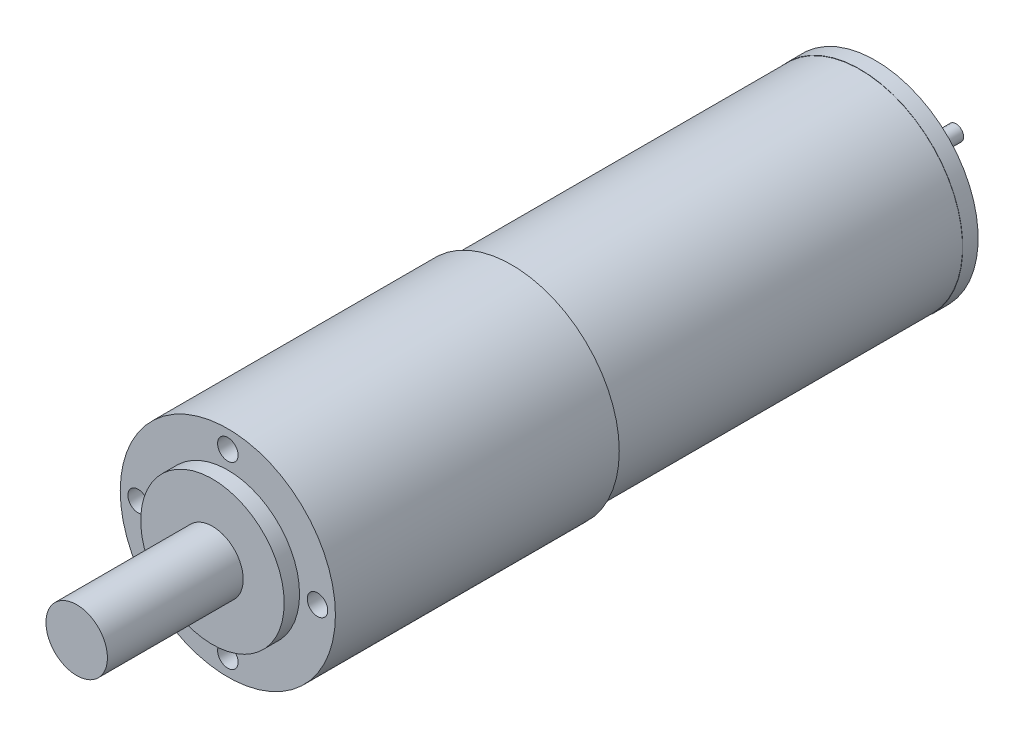
ISO-10303-21;
HEADER;
FILE_DESCRIPTION(('STEP AP214'),'2;1');
FILE_NAME('part.step','',(''),(''),'','','');
FILE_SCHEMA(('AUTOMOTIVE_DESIGN { 1 0 10303 214 1 1 1 1 }'));
ENDSEC;
DATA;
#1=APPLICATION_CONTEXT('core data for automotive mechanical design processes');
#2=APPLICATION_PROTOCOL_DEFINITION('international standard','automotive_design',2000,#1);
#3=PRODUCT_CONTEXT('',#1,'mechanical');
#4=PRODUCT('Part','Part','',(#3));
#5=PRODUCT_RELATED_PRODUCT_CATEGORY('part','',(#4));
#6=PRODUCT_DEFINITION_FORMATION('','',#4);
#7=PRODUCT_DEFINITION_CONTEXT('part definition',#1,'design');
#8=PRODUCT_DEFINITION('design','',#6,#7);
#9=PRODUCT_DEFINITION_SHAPE('','',#8);
#10=(LENGTH_UNIT() NAMED_UNIT(*) SI_UNIT(.MILLI.,.METRE.));
#11=(NAMED_UNIT(*) PLANE_ANGLE_UNIT() SI_UNIT($,.RADIAN.));
#12=(NAMED_UNIT(*) SI_UNIT($,.STERADIAN.) SOLID_ANGLE_UNIT());
#13=UNCERTAINTY_MEASURE_WITH_UNIT(LENGTH_MEASURE(1.E-05),#10,'distance_accuracy_value','');
#14=(GEOMETRIC_REPRESENTATION_CONTEXT(3) GLOBAL_UNCERTAINTY_ASSIGNED_CONTEXT((#13)) GLOBAL_UNIT_ASSIGNED_CONTEXT((#10,
#11,#12)) REPRESENTATION_CONTEXT('',''));
#15=CARTESIAN_POINT('',(0.,0.,0.));
#16=DIRECTION('',(0.,0.,1.));
#17=DIRECTION('',(1.,0.,0.));
#18=AXIS2_PLACEMENT_3D('',#15,#16,#17);
#19=CARTESIAN_POINT('',(0.,0.,-1.35));
#20=DIRECTION('',(0.,0.,-1.));
#21=DIRECTION('',(-1.,0.,0.));
#22=AXIS2_PLACEMENT_3D('',#19,#20,#21);
#23=PLANE('',#22);
#24=CARTESIAN_POINT('',(0.,0.,-1.35));
#25=DIRECTION('',(0.,0.,-1.));
#26=DIRECTION('',(-1.,0.,0.));
#27=AXIS2_PLACEMENT_3D('',#24,#25,#26);
#28=CIRCLE('',#27,4.);
#29=CARTESIAN_POINT('',(4.,0.,-1.35));
#30=VERTEX_POINT('',#29);
#31=EDGE_CURVE('E181',#30,#30,#28,.T.);
#32=ORIENTED_EDGE('',*,*,#31,.T.);
#33=EDGE_LOOP('',(#32));
#34=FACE_BOUND('',#33,.T.);
#35=CARTESIAN_POINT('',(0.,0.,-1.35));
#36=DIRECTION('',(0.,0.,-1.));
#37=DIRECTION('',(-1.,0.,0.));
#38=AXIS2_PLACEMENT_3D('',#35,#36,#37);
#39=CIRCLE('',#38,1.5);
#40=CARTESIAN_POINT('',(-1.5,0.,-1.35));
#41=VERTEX_POINT('',#40);
#42=EDGE_CURVE('E180',#41,#41,#39,.F.);
#43=ORIENTED_EDGE('',*,*,#42,.T.);
#44=EDGE_LOOP('',(#43));
#45=FACE_BOUND('',#44,.T.);
#46=ADVANCED_FACE('F34',(#34,#45),#23,.T.);
#47=CARTESIAN_POINT('',(0.,0.,0.));
#48=DIRECTION('',(0.,0.,1.));
#49=DIRECTION('',(1.,0.,0.));
#50=AXIS2_PLACEMENT_3D('',#47,#48,#49);
#51=PLANE('',#50);
#52=CARTESIAN_POINT('',(-9.04130635862028,-12.2186242813818,0.));
#53=DIRECTION('',(0.,0.,-1.));
#54=DIRECTION('',(-1.,0.,0.));
#55=AXIS2_PLACEMENT_3D('',#52,#53,#54);
#56=CIRCLE('',#55,1.);
#57=CARTESIAN_POINT('',(-10.0413063586203,-12.2186242813818,0.));
#58=VERTEX_POINT('',#57);
#59=EDGE_CURVE('E437',#58,#58,#56,.T.);
#60=ORIENTED_EDGE('',*,*,#59,.F.);
#61=EDGE_LOOP('',(#60));
#62=FACE_BOUND('',#61,.T.);
#63=CARTESIAN_POINT('',(-12.2186242813817,9.04130635862033,0.));
#64=DIRECTION('',(0.,0.,-1.));
#65=DIRECTION('',(-1.,0.,0.));
#66=AXIS2_PLACEMENT_3D('',#63,#64,#65);
#67=CIRCLE('',#66,1.);
#68=CARTESIAN_POINT('',(-13.2186242813817,9.04130635862033,0.));
#69=VERTEX_POINT('',#68);
#70=EDGE_CURVE('E443',#69,#69,#67,.T.);
#71=ORIENTED_EDGE('',*,*,#70,.F.);
#72=EDGE_LOOP('',(#71));
#73=FACE_BOUND('',#72,.T.);
#74=CARTESIAN_POINT('',(9.04130635862037,12.2186242813817,0.));
#75=DIRECTION('',(0.,0.,-1.));
#76=DIRECTION('',(-1.,0.,0.));
#77=AXIS2_PLACEMENT_3D('',#74,#75,#76);
#78=CIRCLE('',#77,1.);
#79=CARTESIAN_POINT('',(8.04130635862037,12.2186242813817,0.));
#80=VERTEX_POINT('',#79);
#81=EDGE_CURVE('E449',#80,#80,#78,.T.);
#82=ORIENTED_EDGE('',*,*,#81,.F.);
#83=EDGE_LOOP('',(#82));
#84=FACE_BOUND('',#83,.T.);
#85=CARTESIAN_POINT('',(10.2089821298386,-7.55424939174206,0.));
#86=DIRECTION('',(0.,0.,-1.));
#87=DIRECTION('',(-1.,0.,0.));
#88=AXIS2_PLACEMENT_3D('',#85,#86,#87);
#89=CIRCLE('',#88,0.800000000000001);
#90=CARTESIAN_POINT('',(9.40898212983864,-7.55424939174206,0.));
#91=VERTEX_POINT('',#90);
#92=EDGE_CURVE('E455',#91,#91,#89,.T.);
#93=ORIENTED_EDGE('',*,*,#92,.F.);
#94=EDGE_LOOP('',(#93));
#95=FACE_BOUND('',#94,.T.);
#96=CARTESIAN_POINT('',(-10.2089821298386,7.55424939174205,0.));
#97=DIRECTION('',(0.,0.,-1.));
#98=DIRECTION('',(-1.,0.,0.));
#99=AXIS2_PLACEMENT_3D('',#96,#97,#98);
#100=CIRCLE('',#99,0.800000000000001);
#101=CARTESIAN_POINT('',(-11.0089821298386,7.55424939174205,0.));
#102=VERTEX_POINT('',#101);
#103=EDGE_CURVE('E461',#102,#102,#100,.T.);
#104=ORIENTED_EDGE('',*,*,#103,.F.);
#105=EDGE_LOOP('',(#104));
#106=FACE_BOUND('',#105,.T.);
#107=CARTESIAN_POINT('',(12.2186242813817,-9.04130635862041,0.));
#108=DIRECTION('',(0.,0.,-1.));
#109=DIRECTION('',(-1.,0.,0.));
#110=AXIS2_PLACEMENT_3D('',#107,#108,#109);
#111=CIRCLE('',#110,1.);
#112=CARTESIAN_POINT('',(11.2186242813817,-9.04130635862041,0.));
#113=VERTEX_POINT('',#112);
#114=EDGE_CURVE('E467',#113,#113,#111,.T.);
#115=ORIENTED_EDGE('',*,*,#114,.F.);
#116=EDGE_LOOP('',(#115));
#117=FACE_BOUND('',#116,.T.);
#118=CARTESIAN_POINT('',(1.72068884927214,15.1022922062841,0.));
#119=DIRECTION('',(0.,0.,-1.));
#120=DIRECTION('',(-1.,0.,0.));
#121=AXIS2_PLACEMENT_3D('',#118,#119,#120);
#122=CIRCLE('',#121,1.);
#123=CARTESIAN_POINT('',(0.720688849272138,15.1022922062841,0.));
#124=VERTEX_POINT('',#123);
#125=EDGE_CURVE('E473',#124,#124,#122,.T.);
#126=ORIENTED_EDGE('',*,*,#125,.F.);
#127=EDGE_LOOP('',(#126));
#128=FACE_BOUND('',#127,.T.);
#129=CARTESIAN_POINT('',(-1.72068884927214,-15.1022922062841,0.));
#130=DIRECTION('',(0.,0.,-1.));
#131=DIRECTION('',(-1.,0.,0.));
#132=AXIS2_PLACEMENT_3D('',#129,#130,#131);
#133=CIRCLE('',#132,1.);
#134=CARTESIAN_POINT('',(-2.72068884927214,-15.1022922062841,0.));
#135=VERTEX_POINT('',#134);
#136=EDGE_CURVE('E125',#135,#135,#133,.T.);
#137=ORIENTED_EDGE('',*,*,#136,.F.);
#138=EDGE_LOOP('',(#137));
#139=FACE_BOUND('',#138,.T.);
#140=DIRECTION('',(-0.965925826289066,-0.258819045102528,0.));
#141=VECTOR('',#140,1.);
#142=CARTESIAN_POINT('',(-12.2595640172225,-5.87313072899772,0.));
#143=LINE('',#142,#141);
#144=CARTESIAN_POINT('',(-12.2595640172225,-5.87313072899772,0.));
#145=VERTEX_POINT('',#144);
#146=CARTESIAN_POINT('',(-18.0551189749569,-7.42604499961289,0.));
#147=VERTEX_POINT('',#146);
#148=EDGE_CURVE('E131',#145,#147,#143,.T.);
#149=ORIENTED_EDGE('',*,*,#148,.F.);
#150=DIRECTION('',(0.258819045102528,-0.965925826289066,0.));
#151=VECTOR('',#150,1.);
#152=CARTESIAN_POINT('',(-13.5536592427351,-1.04350159755239,0.));
#153=LINE('',#152,#151);
#154=CARTESIAN_POINT('',(-13.5536592427351,-1.04350159755239,0.));
#155=VERTEX_POINT('',#154);
#156=EDGE_CURVE('E49',#155,#145,#153,.T.);
#157=ORIENTED_EDGE('',*,*,#156,.F.);
#158=DIRECTION('',(0.965925826289066,0.258819045102528,0.));
#159=VECTOR('',#158,1.);
#160=CARTESIAN_POINT('',(-13.5536592427351,-1.04350159755239,0.));
#161=LINE('',#160,#159);
#162=CARTESIAN_POINT('',(-19.3492142004695,-2.59641586816756,0.));
#163=VERTEX_POINT('',#162);
#164=EDGE_CURVE('E119',#163,#155,#161,.T.);
#165=ORIENTED_EDGE('',*,*,#164,.F.);
#166=DIRECTION('',(-0.258819045102528,0.965925826289066,0.));
#167=VECTOR('',#166,1.);
#168=CARTESIAN_POINT('',(-19.3492142004695,-2.59641586816756,0.));
#169=LINE('',#168,#167);
#170=EDGE_CURVE('E122',#147,#163,#169,.T.);
#171=ORIENTED_EDGE('',*,*,#170,.F.);
#172=EDGE_LOOP('',(#149,#157,#165,#171));
#173=FACE_BOUND('',#172,.T.);
#174=DIRECTION('',(0.989015863361917,0.147809411129611,0.));
#175=VECTOR('',#174,1.);
#176=CARTESIAN_POINT('',(12.8456150437793,4.44755535089839,0.));
#177=LINE('',#176,#175);
#178=CARTESIAN_POINT('',(12.8456150437793,4.44755535089839,0.));
#179=VERTEX_POINT('',#178);
#180=CARTESIAN_POINT('',(18.7797102239508,5.33441181767605,0.));
#181=VERTEX_POINT('',#180);
#182=EDGE_CURVE('E156',#179,#181,#177,.T.);
#183=ORIENTED_EDGE('',*,*,#182,.F.);
#184=DIRECTION('',(-0.147809411129612,0.989015863361917,0.));
#185=VECTOR('',#184,1.);
#186=CARTESIAN_POINT('',(13.5846620994273,-0.497523965911195,0.));
#187=LINE('',#186,#185);
#188=CARTESIAN_POINT('',(13.5846620994273,-0.497523965911195,0.));
#189=VERTEX_POINT('',#188);
#190=EDGE_CURVE('E57',#189,#179,#187,.T.);
#191=ORIENTED_EDGE('',*,*,#190,.F.);
#192=DIRECTION('',(-0.989015863361917,-0.147809411129611,0.));
#193=VECTOR('',#192,1.);
#194=CARTESIAN_POINT('',(13.5846620994273,-0.497523965911195,0.));
#195=LINE('',#194,#193);
#196=CARTESIAN_POINT('',(19.5187572795988,0.389332500866468,0.));
#197=VERTEX_POINT('',#196);
#198=EDGE_CURVE('E145',#197,#189,#195,.T.);
#199=ORIENTED_EDGE('',*,*,#198,.F.);
#200=DIRECTION('',(0.14780941112961,-0.989015863361917,0.));
#201=VECTOR('',#200,1.);
#202=CARTESIAN_POINT('',(19.5187572795988,0.389332500866468,0.));
#203=LINE('',#202,#201);
#204=EDGE_CURVE('E159',#181,#197,#203,.T.);
#205=ORIENTED_EDGE('',*,*,#204,.F.);
#206=EDGE_LOOP('',(#183,#191,#199,#205));
#207=FACE_BOUND('',#206,.T.);
#208=CARTESIAN_POINT('',(0.,0.,0.));
#209=DIRECTION('',(0.,0.,1.));
#210=DIRECTION('',(1.,0.,0.));
#211=AXIS2_PLACEMENT_3D('',#208,#209,#210);
#212=CIRCLE('',#211,4.);
#213=CARTESIAN_POINT('',(4.,0.,0.));
#214=VERTEX_POINT('',#213);
#215=EDGE_CURVE('E42',#214,#214,#212,.F.);
#216=ORIENTED_EDGE('',*,*,#215,.F.);
#217=EDGE_LOOP('',(#216));
#218=FACE_BOUND('',#217,.T.);
#219=CARTESIAN_POINT('',(0.,0.,0.));
#220=DIRECTION('',(0.,0.,-1.));
#221=DIRECTION('',(-1.,0.,0.));
#222=AXIS2_PLACEMENT_3D('',#219,#220,#221);
#223=CIRCLE('',#222,20.05);
#224=CARTESIAN_POINT('',(-20.05,0.,0.));
#225=VERTEX_POINT('',#224);
#226=EDGE_CURVE('E166',#225,#225,#223,.T.);
#227=ORIENTED_EDGE('',*,*,#226,.T.);
#228=EDGE_LOOP('',(#227));
#229=FACE_BOUND('',#228,.T.);
#230=ADVANCED_FACE('F211',(#62,#73,#84,#95,#106,#117,#128,#139,#173,#207,#218,#229),#51,.F.);
#231=CARTESIAN_POINT('',(0.,0.,-1.35));
#232=DIRECTION('',(0.,0.,1.));
#233=DIRECTION('',(1.,0.,0.));
#234=AXIS2_PLACEMENT_3D('',#231,#232,#233);
#235=CYLINDRICAL_SURFACE('',#234,4.);
#236=CARTESIAN_POINT('',(4.,0.,-1.35));
#237=CARTESIAN_POINT('',(4.,0.,-1.3359375));
#238=CARTESIAN_POINT('',(4.,0.,-1.321875));
#239=CARTESIAN_POINT('',(4.,0.,-1.29375));
#240=CARTESIAN_POINT('',(4.,0.,-1.2796875));
#241=CARTESIAN_POINT('',(4.,0.,-1.2515625));
#242=CARTESIAN_POINT('',(4.,0.,-1.2375));
#243=CARTESIAN_POINT('',(4.,0.,-1.209375));
#244=CARTESIAN_POINT('',(4.,0.,-1.1953125));
#245=CARTESIAN_POINT('',(4.,0.,-1.1671875));
#246=CARTESIAN_POINT('',(4.,0.,-1.153125));
#247=CARTESIAN_POINT('',(4.,0.,-1.125));
#248=CARTESIAN_POINT('',(4.,0.,-1.1109375));
#249=CARTESIAN_POINT('',(4.,0.,-1.0828125));
#250=CARTESIAN_POINT('',(4.,0.,-1.06875));
#251=CARTESIAN_POINT('',(4.,0.,-1.040625));
#252=CARTESIAN_POINT('',(4.,0.,-1.0265625));
#253=CARTESIAN_POINT('',(4.,0.,-0.9984375));
#254=CARTESIAN_POINT('',(4.,0.,-0.984375));
#255=CARTESIAN_POINT('',(4.,0.,-0.95625));
#256=CARTESIAN_POINT('',(4.,0.,-0.9421875));
#257=CARTESIAN_POINT('',(4.,0.,-0.9140625));
#258=CARTESIAN_POINT('',(4.,0.,-0.9));
#259=CARTESIAN_POINT('',(4.,0.,-0.871875));
#260=CARTESIAN_POINT('',(4.,0.,-0.8578125));
#261=CARTESIAN_POINT('',(4.,0.,-0.8296875));
#262=CARTESIAN_POINT('',(4.,0.,-0.815625));
#263=CARTESIAN_POINT('',(4.,0.,-0.7875));
#264=CARTESIAN_POINT('',(4.,0.,-0.7734375));
#265=CARTESIAN_POINT('',(4.,0.,-0.7453125));
#266=CARTESIAN_POINT('',(4.,0.,-0.73125));
#267=CARTESIAN_POINT('',(4.,0.,-0.703125));
#268=CARTESIAN_POINT('',(4.,0.,-0.6890625));
#269=CARTESIAN_POINT('',(4.,0.,-0.6609375));
#270=CARTESIAN_POINT('',(4.,0.,-0.646875));
#271=CARTESIAN_POINT('',(4.,0.,-0.61875));
#272=CARTESIAN_POINT('',(4.,0.,-0.6046875));
#273=CARTESIAN_POINT('',(4.,0.,-0.5765625));
#274=CARTESIAN_POINT('',(4.,0.,-0.5625));
#275=CARTESIAN_POINT('',(4.,0.,-0.534375));
#276=CARTESIAN_POINT('',(4.,0.,-0.5203125));
#277=CARTESIAN_POINT('',(4.,0.,-0.4921875));
#278=CARTESIAN_POINT('',(4.,0.,-0.478125));
#279=CARTESIAN_POINT('',(4.,0.,-0.45));
#280=CARTESIAN_POINT('',(4.,0.,-0.4359375));
#281=CARTESIAN_POINT('',(4.,0.,-0.4078125));
#282=CARTESIAN_POINT('',(4.,0.,-0.39375));
#283=CARTESIAN_POINT('',(4.,0.,-0.365625));
#284=CARTESIAN_POINT('',(4.,0.,-0.3515625));
#285=CARTESIAN_POINT('',(4.,0.,-0.3234375));
#286=CARTESIAN_POINT('',(4.,0.,-0.309375));
#287=CARTESIAN_POINT('',(4.,0.,-0.28125));
#288=CARTESIAN_POINT('',(4.,0.,-0.2671875));
#289=CARTESIAN_POINT('',(4.,0.,-0.2390625));
#290=CARTESIAN_POINT('',(4.,0.,-0.225));
#291=CARTESIAN_POINT('',(4.,0.,-0.196875));
#292=CARTESIAN_POINT('',(4.,0.,-0.1828125));
#293=CARTESIAN_POINT('',(4.,0.,-0.1546875));
#294=CARTESIAN_POINT('',(4.,0.,-0.140625));
#295=CARTESIAN_POINT('',(4.,0.,-0.1125));
#296=CARTESIAN_POINT('',(4.,0.,-0.0984375000000002));
#297=CARTESIAN_POINT('',(4.,0.,-0.0703125000000002));
#298=CARTESIAN_POINT('',(4.,0.,-0.0562500000000002));
#299=CARTESIAN_POINT('',(4.,0.,-0.0281250000000002));
#300=CARTESIAN_POINT('',(4.,0.,-0.0140625000000002));
#301=CARTESIAN_POINT('',(4.,0.,0.));
#302=B_SPLINE_CURVE_WITH_KNOTS('',3,(#236,#237,#238,#239,#240,#241,#242,#243,#244,#245,#246,
#247,#248,#249,#250,#251,#252,#253,#254,#255,#256,#257,#258,#259,#260,#261,#262,#263,#264,#265,
#266,#267,#268,#269,#270,#271,#272,#273,#274,#275,#276,#277,#278,#279,#280,#281,#282,#283,#284,
#285,#286,#287,#288,#289,#290,#291,#292,#293,#294,#295,#296,#297,#298,#299,#300,#301),
.UNSPECIFIED.,.F.,.F.,(4,2,2,2,2,2,2,2,2,2,2,2,2,2,2,2,2,2,2,2,2,2,2,2,2,2,2,2,2,2,2,2,4),(0.,
0.0421874999999999,0.0843749999999998,0.1265625,0.16875,0.2109375,0.253125,0.2953125,0.3375,
0.3796875,0.421875,0.4640625,0.50625,0.5484375,0.590625,0.6328125,0.675,0.7171875,0.759375,
0.8015625,0.84375,0.8859375,0.928125,0.9703125,1.0125,1.0546875,1.096875,1.1390625,1.18125,
1.2234375,1.265625,1.3078125,1.35),.UNSPECIFIED.);
#303=EDGE_CURVE('BSEAM196',#30,#214,#302,.T.);
#304=ORIENTED_EDGE('',*,*,#31,.F.);
#305=ORIENTED_EDGE('',*,*,#215,.T.);
#306=ORIENTED_EDGE('',*,*,#303,.T.);
#307=ORIENTED_EDGE('',*,*,#303,.F.);
#308=EDGE_LOOP('',(#304,#306,#305,#307));
#309=FACE_BOUND('',#308,.T.);
#310=ADVANCED_FACE('F196',(#309),#235,.T.);
#311=CARTESIAN_POINT('',(0.,0.,-15.7));
#312=DIRECTION('',(0.,0.,1.));
#313=DIRECTION('',(1.,0.,0.));
#314=AXIS2_PLACEMENT_3D('',#311,#312,#313);
#315=CYLINDRICAL_SURFACE('',#314,1.5);
#316=ORIENTED_EDGE('',*,*,#42,.F.);
#317=EDGE_LOOP('',(#316));
#318=FACE_BOUND('',#317,.T.);
#319=CARTESIAN_POINT('',(0.,0.,-15.7));
#320=DIRECTION('',(0.,0.,-1.));
#321=DIRECTION('',(-1.,0.,0.));
#322=AXIS2_PLACEMENT_3D('',#319,#320,#321);
#323=CIRCLE('',#322,1.5);
#324=CARTESIAN_POINT('',(-1.5,0.,-15.7));
#325=VERTEX_POINT('',#324);
#326=EDGE_CURVE('E175',#325,#325,#323,.T.);
#327=ORIENTED_EDGE('',*,*,#326,.F.);
#328=EDGE_LOOP('',(#327));
#329=FACE_BOUND('',#328,.T.);
#330=ADVANCED_FACE('F192',(#318,#329),#315,.T.);
#331=CARTESIAN_POINT('',(0.,0.,-15.7));
#332=DIRECTION('',(0.,0.,-1.));
#333=DIRECTION('',(-1.,0.,0.));
#334=AXIS2_PLACEMENT_3D('',#331,#332,#333);
#335=PLANE('',#334);
#336=ORIENTED_EDGE('',*,*,#326,.T.);
#337=EDGE_LOOP('',(#336));
#338=FACE_BOUND('',#337,.T.);
#339=ADVANCED_FACE('F195',(#338),#335,.T.);
#340=CARTESIAN_POINT('',(0.,0.,3.));
#341=DIRECTION('',(0.,0.,-1.));
#342=DIRECTION('',(-1.,0.,0.));
#343=AXIS2_PLACEMENT_3D('',#340,#341,#342);
#344=PLANE('',#343);
#345=CARTESIAN_POINT('',(0.,0.,3.));
#346=DIRECTION('',(0.,0.,-1.));
#347=DIRECTION('',(-1.,0.,0.));
#348=AXIS2_PLACEMENT_3D('',#345,#346,#347);
#349=CIRCLE('',#348,20.05);
#350=CARTESIAN_POINT('',(-20.05,0.,3.));
#351=VERTEX_POINT('',#350);
#352=EDGE_CURVE('E172',#351,#351,#349,.T.);
#353=ORIENTED_EDGE('',*,*,#352,.F.);
#354=EDGE_LOOP('',(#353));
#355=FACE_BOUND('',#354,.T.);
#356=CARTESIAN_POINT('',(0.,0.,3.));
#357=DIRECTION('',(0.,0.,-1.));
#358=DIRECTION('',(-1.,0.,0.));
#359=AXIS2_PLACEMENT_3D('',#356,#357,#358);
#360=CIRCLE('',#359,20.);
#361=CARTESIAN_POINT('',(-20.,0.,3.));
#362=VERTEX_POINT('',#361);
#363=EDGE_CURVE('E11',#362,#362,#360,.T.);
#364=ORIENTED_EDGE('',*,*,#363,.T.);
#365=EDGE_LOOP('',(#364));
#366=FACE_BOUND('',#365,.T.);
#367=ADVANCED_FACE('F201',(#355,#366),#344,.F.);
#368=CARTESIAN_POINT('',(0.,0.,3.));
#369=DIRECTION('',(0.,0.,-1.));
#370=DIRECTION('',(-1.,0.,0.));
#371=AXIS2_PLACEMENT_3D('',#368,#369,#370);
#372=CYLINDRICAL_SURFACE('',#371,20.05);
#373=ORIENTED_EDGE('',*,*,#352,.T.);
#374=EDGE_LOOP('',(#373));
#375=FACE_BOUND('',#374,.T.);
#376=ORIENTED_EDGE('',*,*,#226,.F.);
#377=EDGE_LOOP('',(#376));
#378=FACE_BOUND('',#377,.T.);
#379=ADVANCED_FACE('F206',(#375,#378),#372,.T.);
#380=CARTESIAN_POINT('',(0.,0.,71.));
#381=DIRECTION('',(0.,0.,-1.));
#382=DIRECTION('',(-1.,0.,0.));
#383=AXIS2_PLACEMENT_3D('',#380,#381,#382);
#384=CYLINDRICAL_SURFACE('',#383,20.);
#385=CARTESIAN_POINT('',(0.,0.,71.));
#386=DIRECTION('',(0.,0.,1.));
#387=DIRECTION('',(1.,0.,0.));
#388=AXIS2_PLACEMENT_3D('',#385,#386,#387);
#389=CIRCLE('',#388,20.);
#390=CARTESIAN_POINT('',(20.,0.,71.));
#391=VERTEX_POINT('',#390);
#392=EDGE_CURVE('E184',#391,#391,#389,.T.);
#393=ORIENTED_EDGE('',*,*,#392,.F.);
#394=EDGE_LOOP('',(#393));
#395=FACE_BOUND('',#394,.T.);
#396=ORIENTED_EDGE('',*,*,#363,.F.);
#397=EDGE_LOOP('',(#396));
#398=FACE_BOUND('',#397,.T.);
#399=ADVANCED_FACE('F36',(#395,#398),#384,.T.);
#400=CARTESIAN_POINT('',(13.5846620994273,-0.497523965911195,1.));
#401=DIRECTION('',(-0.989015863361917,-0.147809411129612,0.));
#402=DIRECTION('',(0.147809411129612,-0.989015863361917,0.));
#403=AXIS2_PLACEMENT_3D('',#400,#401,#402);
#404=PLANE('',#403);
#405=ORIENTED_EDGE('',*,*,#190,.T.);
#406=DIRECTION('',(0.,0.,-1.));
#407=VECTOR('',#406,1.);
#408=CARTESIAN_POINT('',(12.8456150437793,4.44755535089839,1.));
#409=LINE('',#408,#407);
#410=CARTESIAN_POINT('',(12.8456150437793,4.44755535089839,1.));
#411=VERTEX_POINT('',#410);
#412=EDGE_CURVE('E154',#411,#179,#409,.T.);
#413=ORIENTED_EDGE('',*,*,#412,.F.);
#414=DIRECTION('',(-0.147809411129612,0.989015863361917,0.));
#415=VECTOR('',#414,1.);
#416=CARTESIAN_POINT('',(13.5846620994273,-0.497523965911195,1.));
#417=LINE('',#416,#415);
#418=CARTESIAN_POINT('',(13.5846620994273,-0.497523965911195,1.));
#419=VERTEX_POINT('',#418);
#420=EDGE_CURVE('E141',#419,#411,#417,.T.);
#421=ORIENTED_EDGE('',*,*,#420,.F.);
#422=DIRECTION('',(0.,0.,-1.));
#423=VECTOR('',#422,1.);
#424=CARTESIAN_POINT('',(13.5846620994273,-0.497523965911195,1.));
#425=LINE('',#424,#423);
#426=EDGE_CURVE('E164',#419,#189,#425,.T.);
#427=ORIENTED_EDGE('',*,*,#426,.T.);
#428=EDGE_LOOP('',(#405,#413,#421,#427));
#429=FACE_BOUND('',#428,.T.);
#430=ADVANCED_FACE('F235',(#429),#404,.F.);
#431=CARTESIAN_POINT('',(13.5846620994273,-0.497523965911195,1.));
#432=DIRECTION('',(0.147809411129611,-0.989015863361917,0.));
#433=DIRECTION('',(0.989015863361917,0.147809411129611,0.));
#434=AXIS2_PLACEMENT_3D('',#431,#432,#433);
#435=PLANE('',#434);
#436=ORIENTED_EDGE('',*,*,#198,.T.);
#437=ORIENTED_EDGE('',*,*,#426,.F.);
#438=DIRECTION('',(-0.989015863361917,-0.147809411129611,0.));
#439=VECTOR('',#438,1.);
#440=CARTESIAN_POINT('',(13.5846620994273,-0.497523965911195,1.));
#441=LINE('',#440,#439);
#442=CARTESIAN_POINT('',(19.5187572795988,0.389332500866468,1.));
#443=VERTEX_POINT('',#442);
#444=EDGE_CURVE('E151',#443,#419,#441,.T.);
#445=ORIENTED_EDGE('',*,*,#444,.F.);
#446=DIRECTION('',(0.,0.,-1.));
#447=VECTOR('',#446,1.);
#448=CARTESIAN_POINT('',(19.5187572795988,0.389332500866468,1.));
#449=LINE('',#448,#447);
#450=EDGE_CURVE('E167',#443,#197,#449,.T.);
#451=ORIENTED_EDGE('',*,*,#450,.T.);
#452=EDGE_LOOP('',(#436,#437,#445,#451));
#453=FACE_BOUND('',#452,.T.);
#454=ADVANCED_FACE('F240',(#453),#435,.F.);
#455=CARTESIAN_POINT('',(19.5187572795988,0.389332500866468,1.));
#456=DIRECTION('',(0.989015863361917,0.14780941112961,0.));
#457=DIRECTION('',(-0.14780941112961,0.989015863361917,0.));
#458=AXIS2_PLACEMENT_3D('',#455,#456,#457);
#459=PLANE('',#458);
#460=ORIENTED_EDGE('',*,*,#204,.T.);
#461=ORIENTED_EDGE('',*,*,#450,.F.);
#462=DIRECTION('',(0.14780941112961,-0.989015863361917,0.));
#463=VECTOR('',#462,1.);
#464=CARTESIAN_POINT('',(19.5187572795988,0.389332500866468,1.));
#465=LINE('',#464,#463);
#466=CARTESIAN_POINT('',(18.7797102239508,5.33441181767605,1.));
#467=VERTEX_POINT('',#466);
#468=EDGE_CURVE('E148',#467,#443,#465,.T.);
#469=ORIENTED_EDGE('',*,*,#468,.F.);
#470=DIRECTION('',(0.,0.,-1.));
#471=VECTOR('',#470,1.);
#472=CARTESIAN_POINT('',(18.7797102239508,5.33441181767605,1.));
#473=LINE('',#472,#471);
#474=EDGE_CURVE('E169',#467,#181,#473,.T.);
#475=ORIENTED_EDGE('',*,*,#474,.T.);
#476=EDGE_LOOP('',(#460,#461,#469,#475));
#477=FACE_BOUND('',#476,.T.);
#478=ADVANCED_FACE('F245',(#477),#459,.F.);
#479=CARTESIAN_POINT('',(12.8456150437793,4.44755535089839,1.));
#480=DIRECTION('',(-0.147809411129611,0.989015863361917,0.));
#481=DIRECTION('',(-0.989015863361917,-0.147809411129611,0.));
#482=AXIS2_PLACEMENT_3D('',#479,#480,#481);
#483=PLANE('',#482);
#484=ORIENTED_EDGE('',*,*,#182,.T.);
#485=ORIENTED_EDGE('',*,*,#474,.F.);
#486=DIRECTION('',(0.989015863361917,0.147809411129611,0.));
#487=VECTOR('',#486,1.);
#488=CARTESIAN_POINT('',(12.8456150437793,4.44755535089839,1.));
#489=LINE('',#488,#487);
#490=EDGE_CURVE('E144',#411,#467,#489,.T.);
#491=ORIENTED_EDGE('',*,*,#490,.F.);
#492=ORIENTED_EDGE('',*,*,#412,.T.);
#493=EDGE_LOOP('',(#484,#485,#491,#492));
#494=FACE_BOUND('',#493,.T.);
#495=ADVANCED_FACE('F241',(#494),#483,.F.);
#496=CARTESIAN_POINT('',(0.,0.,1.));
#497=DIRECTION('',(0.,0.,-1.));
#498=DIRECTION('',(-1.,0.,0.));
#499=AXIS2_PLACEMENT_3D('',#496,#497,#498);
#500=PLANE('',#499);
#501=ORIENTED_EDGE('',*,*,#420,.T.);
#502=ORIENTED_EDGE('',*,*,#490,.T.);
#503=ORIENTED_EDGE('',*,*,#468,.T.);
#504=ORIENTED_EDGE('',*,*,#444,.T.);
#505=EDGE_LOOP('',(#501,#502,#503,#504));
#506=FACE_BOUND('',#505,.T.);
#507=ADVANCED_FACE('F244',(#506),#500,.T.);
#508=CARTESIAN_POINT('',(-13.5536592427351,-1.04350159755239,1.));
#509=DIRECTION('',(0.965925826289066,0.258819045102528,0.));
#510=DIRECTION('',(-0.258819045102528,0.965925826289066,0.));
#511=AXIS2_PLACEMENT_3D('',#508,#509,#510);
#512=PLANE('',#511);
#513=ORIENTED_EDGE('',*,*,#156,.T.);
#514=DIRECTION('',(0.,0.,-1.));
#515=VECTOR('',#514,1.);
#516=CARTESIAN_POINT('',(-12.2595640172225,-5.87313072899772,1.));
#517=LINE('',#516,#515);
#518=CARTESIAN_POINT('',(-12.2595640172225,-5.87313072899772,1.));
#519=VERTEX_POINT('',#518);
#520=EDGE_CURVE('E97',#519,#145,#517,.T.);
#521=ORIENTED_EDGE('',*,*,#520,.F.);
#522=DIRECTION('',(0.258819045102528,-0.965925826289066,0.));
#523=VECTOR('',#522,1.);
#524=CARTESIAN_POINT('',(-13.5536592427351,-1.04350159755239,1.));
#525=LINE('',#524,#523);
#526=CARTESIAN_POINT('',(-13.5536592427351,-1.04350159755239,1.));
#527=VERTEX_POINT('',#526);
#528=EDGE_CURVE('E101',#527,#519,#525,.T.);
#529=ORIENTED_EDGE('',*,*,#528,.F.);
#530=DIRECTION('',(0.,0.,-1.));
#531=VECTOR('',#530,1.);
#532=CARTESIAN_POINT('',(-13.5536592427351,-1.04350159755239,1.));
#533=LINE('',#532,#531);
#534=EDGE_CURVE('E136',#527,#155,#533,.T.);
#535=ORIENTED_EDGE('',*,*,#534,.T.);
#536=EDGE_LOOP('',(#513,#521,#529,#535));
#537=FACE_BOUND('',#536,.T.);
#538=ADVANCED_FACE('F99',(#537),#512,.F.);
#539=CARTESIAN_POINT('',(-13.5536592427351,-1.04350159755239,1.));
#540=DIRECTION('',(-0.258819045102528,0.965925826289066,0.));
#541=DIRECTION('',(-0.965925826289066,-0.258819045102528,0.));
#542=AXIS2_PLACEMENT_3D('',#539,#540,#541);
#543=PLANE('',#542);
#544=ORIENTED_EDGE('',*,*,#164,.T.);
#545=ORIENTED_EDGE('',*,*,#534,.F.);
#546=DIRECTION('',(0.965925826289066,0.258819045102528,0.));
#547=VECTOR('',#546,1.);
#548=CARTESIAN_POINT('',(-13.5536592427351,-1.04350159755239,1.));
#549=LINE('',#548,#547);
#550=CARTESIAN_POINT('',(-19.3492142004695,-2.59641586816756,1.));
#551=VERTEX_POINT('',#550);
#552=EDGE_CURVE('E107',#551,#527,#549,.T.);
#553=ORIENTED_EDGE('',*,*,#552,.F.);
#554=DIRECTION('',(0.,0.,-1.));
#555=VECTOR('',#554,1.);
#556=CARTESIAN_POINT('',(-19.3492142004695,-2.59641586816756,1.));
#557=LINE('',#556,#555);
#558=EDGE_CURVE('E138',#551,#163,#557,.T.);
#559=ORIENTED_EDGE('',*,*,#558,.T.);
#560=EDGE_LOOP('',(#544,#545,#553,#559));
#561=FACE_BOUND('',#560,.T.);
#562=ADVANCED_FACE('F258',(#561),#543,.F.);
#563=CARTESIAN_POINT('',(-19.3492142004695,-2.59641586816756,1.));
#564=DIRECTION('',(-0.965925826289066,-0.258819045102528,0.));
#565=DIRECTION('',(0.258819045102528,-0.965925826289066,0.));
#566=AXIS2_PLACEMENT_3D('',#563,#564,#565);
#567=PLANE('',#566);
#568=ORIENTED_EDGE('',*,*,#170,.T.);
#569=ORIENTED_EDGE('',*,*,#558,.F.);
#570=DIRECTION('',(-0.258819045102528,0.965925826289066,0.));
#571=VECTOR('',#570,1.);
#572=CARTESIAN_POINT('',(-19.3492142004695,-2.59641586816756,1.));
#573=LINE('',#572,#571);
#574=CARTESIAN_POINT('',(-18.0551189749569,-7.42604499961289,1.));
#575=VERTEX_POINT('',#574);
#576=EDGE_CURVE('E115',#575,#551,#573,.T.);
#577=ORIENTED_EDGE('',*,*,#576,.F.);
#578=DIRECTION('',(0.,0.,-1.));
#579=VECTOR('',#578,1.);
#580=CARTESIAN_POINT('',(-18.0551189749569,-7.42604499961289,1.));
#581=LINE('',#580,#579);
#582=EDGE_CURVE('E106',#575,#147,#581,.T.);
#583=ORIENTED_EDGE('',*,*,#582,.T.);
#584=EDGE_LOOP('',(#568,#569,#577,#583));
#585=FACE_BOUND('',#584,.T.);
#586=ADVANCED_FACE('F261',(#585),#567,.F.);
#587=CARTESIAN_POINT('',(-12.2595640172225,-5.87313072899772,1.));
#588=DIRECTION('',(0.258819045102528,-0.965925826289066,0.));
#589=DIRECTION('',(0.965925826289066,0.258819045102528,0.));
#590=AXIS2_PLACEMENT_3D('',#587,#588,#589);
#591=PLANE('',#590);
#592=ORIENTED_EDGE('',*,*,#148,.T.);
#593=ORIENTED_EDGE('',*,*,#582,.F.);
#594=DIRECTION('',(-0.965925826289066,-0.258819045102528,0.));
#595=VECTOR('',#594,1.);
#596=CARTESIAN_POINT('',(-12.2595640172225,-5.87313072899772,1.));
#597=LINE('',#596,#595);
#598=EDGE_CURVE('E110',#519,#575,#597,.T.);
#599=ORIENTED_EDGE('',*,*,#598,.F.);
#600=ORIENTED_EDGE('',*,*,#520,.T.);
#601=EDGE_LOOP('',(#592,#593,#599,#600));
#602=FACE_BOUND('',#601,.T.);
#603=ADVANCED_FACE('F111',(#602),#591,.F.);
#604=CARTESIAN_POINT('',(0.,0.,1.));
#605=DIRECTION('',(0.,0.,-1.));
#606=DIRECTION('',(-1.,0.,0.));
#607=AXIS2_PLACEMENT_3D('',#604,#605,#606);
#608=PLANE('',#607);
#609=ORIENTED_EDGE('',*,*,#528,.T.);
#610=ORIENTED_EDGE('',*,*,#598,.T.);
#611=ORIENTED_EDGE('',*,*,#576,.T.);
#612=ORIENTED_EDGE('',*,*,#552,.T.);
#613=EDGE_LOOP('',(#609,#610,#611,#612));
#614=FACE_BOUND('',#613,.T.);
#615=ADVANCED_FACE('F117',(#614),#608,.T.);
#616=CARTESIAN_POINT('',(-1.72068884927214,-15.1022922062841,1.));
#617=DIRECTION('',(0.,0.,-1.));
#618=DIRECTION('',(-1.,0.,0.));
#619=AXIS2_PLACEMENT_3D('',#616,#617,#618);
#620=CYLINDRICAL_SURFACE('',#619,1.);
#621=CARTESIAN_POINT('',(-1.72068884927214,-15.1022922062841,1.));
#622=DIRECTION('',(0.,0.,-1.));
#623=DIRECTION('',(-1.,0.,0.));
#624=AXIS2_PLACEMENT_3D('',#621,#622,#623);
#625=CIRCLE('',#624,1.);
#626=CARTESIAN_POINT('',(-2.72068884927214,-15.1022922062841,1.));
#627=VERTEX_POINT('',#626);
#628=EDGE_CURVE('E132',#627,#627,#625,.T.);
#629=ORIENTED_EDGE('',*,*,#628,.F.);
#630=EDGE_LOOP('',(#629));
#631=FACE_BOUND('',#630,.T.);
#632=ORIENTED_EDGE('',*,*,#136,.T.);
#633=EDGE_LOOP('',(#632));
#634=FACE_BOUND('',#633,.T.);
#635=ADVANCED_FACE('F270',(#631,#634),#620,.F.);
#636=CARTESIAN_POINT('',(-1.72068884927214,-15.1022922062841,1.));
#637=DIRECTION('',(0.,0.,-1.));
#638=DIRECTION('',(-1.,0.,0.));
#639=AXIS2_PLACEMENT_3D('',#636,#637,#638);
#640=PLANE('',#639);
#641=ORIENTED_EDGE('',*,*,#628,.T.);
#642=EDGE_LOOP('',(#641));
#643=FACE_BOUND('',#642,.T.);
#644=ADVANCED_FACE('F273',(#643),#640,.T.);
#645=CARTESIAN_POINT('',(1.72068884927214,15.1022922062841,1.));
#646=DIRECTION('',(0.,0.,-1.));
#647=DIRECTION('',(-1.,0.,0.));
#648=AXIS2_PLACEMENT_3D('',#645,#646,#647);
#649=CYLINDRICAL_SURFACE('',#648,1.);
#650=CARTESIAN_POINT('',(1.72068884927214,15.1022922062841,1.));
#651=DIRECTION('',(0.,0.,-1.));
#652=DIRECTION('',(-1.,0.,0.));
#653=AXIS2_PLACEMENT_3D('',#650,#651,#652);
#654=CIRCLE('',#653,1.);
#655=CARTESIAN_POINT('',(0.720688849272138,15.1022922062841,1.));
#656=VERTEX_POINT('',#655);
#657=EDGE_CURVE('E476',#656,#656,#654,.T.);
#658=ORIENTED_EDGE('',*,*,#657,.F.);
#659=EDGE_LOOP('',(#658));
#660=FACE_BOUND('',#659,.T.);
#661=ORIENTED_EDGE('',*,*,#125,.T.);
#662=EDGE_LOOP('',(#661));
#663=FACE_BOUND('',#662,.T.);
#664=ADVANCED_FACE('F277',(#660,#663),#649,.F.);
#665=CARTESIAN_POINT('',(1.72068884927214,15.1022922062841,1.));
#666=DIRECTION('',(0.,0.,-1.));
#667=DIRECTION('',(-1.,0.,0.));
#668=AXIS2_PLACEMENT_3D('',#665,#666,#667);
#669=PLANE('',#668);
#670=ORIENTED_EDGE('',*,*,#657,.T.);
#671=EDGE_LOOP('',(#670));
#672=FACE_BOUND('',#671,.T.);
#673=ADVANCED_FACE('F281',(#672),#669,.T.);
#674=CARTESIAN_POINT('',(12.2186242813817,-9.04130635862041,1.));
#675=DIRECTION('',(0.,0.,-1.));
#676=DIRECTION('',(-1.,0.,0.));
#677=AXIS2_PLACEMENT_3D('',#674,#675,#676);
#678=CYLINDRICAL_SURFACE('',#677,1.);
#679=CARTESIAN_POINT('',(12.2186242813817,-9.04130635862041,1.));
#680=DIRECTION('',(0.,0.,-1.));
#681=DIRECTION('',(-1.,0.,0.));
#682=AXIS2_PLACEMENT_3D('',#679,#680,#681);
#683=CIRCLE('',#682,1.);
#684=CARTESIAN_POINT('',(11.2186242813817,-9.04130635862041,1.));
#685=VERTEX_POINT('',#684);
#686=EDGE_CURVE('E470',#685,#685,#683,.T.);
#687=ORIENTED_EDGE('',*,*,#686,.F.);
#688=EDGE_LOOP('',(#687));
#689=FACE_BOUND('',#688,.T.);
#690=ORIENTED_EDGE('',*,*,#114,.T.);
#691=EDGE_LOOP('',(#690));
#692=FACE_BOUND('',#691,.T.);
#693=ADVANCED_FACE('F285',(#689,#692),#678,.F.);
#694=CARTESIAN_POINT('',(12.2186242813817,-9.04130635862041,1.));
#695=DIRECTION('',(0.,0.,-1.));
#696=DIRECTION('',(-1.,0.,0.));
#697=AXIS2_PLACEMENT_3D('',#694,#695,#696);
#698=PLANE('',#697);
#699=ORIENTED_EDGE('',*,*,#686,.T.);
#700=EDGE_LOOP('',(#699));
#701=FACE_BOUND('',#700,.T.);
#702=ADVANCED_FACE('F289',(#701),#698,.T.);
#703=CARTESIAN_POINT('',(-10.2089821298386,7.55424939174205,1.));
#704=DIRECTION('',(0.,0.,-1.));
#705=DIRECTION('',(-1.,0.,0.));
#706=AXIS2_PLACEMENT_3D('',#703,#704,#705);
#707=CYLINDRICAL_SURFACE('',#706,0.800000000000001);
#708=CARTESIAN_POINT('',(-10.2089821298386,7.55424939174205,1.));
#709=DIRECTION('',(0.,0.,-1.));
#710=DIRECTION('',(-1.,0.,0.));
#711=AXIS2_PLACEMENT_3D('',#708,#709,#710);
#712=CIRCLE('',#711,0.800000000000001);
#713=CARTESIAN_POINT('',(-11.0089821298386,7.55424939174205,1.));
#714=VERTEX_POINT('',#713);
#715=EDGE_CURVE('E464',#714,#714,#712,.T.);
#716=ORIENTED_EDGE('',*,*,#715,.F.);
#717=EDGE_LOOP('',(#716));
#718=FACE_BOUND('',#717,.T.);
#719=ORIENTED_EDGE('',*,*,#103,.T.);
#720=EDGE_LOOP('',(#719));
#721=FACE_BOUND('',#720,.T.);
#722=ADVANCED_FACE('F293',(#718,#721),#707,.F.);
#723=CARTESIAN_POINT('',(-10.2089821298386,7.55424939174205,1.));
#724=DIRECTION('',(0.,0.,-1.));
#725=DIRECTION('',(-1.,0.,0.));
#726=AXIS2_PLACEMENT_3D('',#723,#724,#725);
#727=PLANE('',#726);
#728=ORIENTED_EDGE('',*,*,#715,.T.);
#729=EDGE_LOOP('',(#728));
#730=FACE_BOUND('',#729,.T.);
#731=ADVANCED_FACE('F297',(#730),#727,.T.);
#732=CARTESIAN_POINT('',(10.2089821298386,-7.55424939174206,1.));
#733=DIRECTION('',(0.,0.,-1.));
#734=DIRECTION('',(-1.,0.,0.));
#735=AXIS2_PLACEMENT_3D('',#732,#733,#734);
#736=CYLINDRICAL_SURFACE('',#735,0.800000000000001);
#737=CARTESIAN_POINT('',(10.2089821298386,-7.55424939174206,1.));
#738=DIRECTION('',(0.,0.,-1.));
#739=DIRECTION('',(-1.,0.,0.));
#740=AXIS2_PLACEMENT_3D('',#737,#738,#739);
#741=CIRCLE('',#740,0.800000000000001);
#742=CARTESIAN_POINT('',(9.40898212983864,-7.55424939174206,1.));
#743=VERTEX_POINT('',#742);
#744=EDGE_CURVE('E458',#743,#743,#741,.T.);
#745=ORIENTED_EDGE('',*,*,#744,.F.);
#746=EDGE_LOOP('',(#745));
#747=FACE_BOUND('',#746,.T.);
#748=ORIENTED_EDGE('',*,*,#92,.T.);
#749=EDGE_LOOP('',(#748));
#750=FACE_BOUND('',#749,.T.);
#751=ADVANCED_FACE('F301',(#747,#750),#736,.F.);
#752=CARTESIAN_POINT('',(10.2089821298386,-7.55424939174206,1.));
#753=DIRECTION('',(0.,0.,-1.));
#754=DIRECTION('',(-1.,0.,0.));
#755=AXIS2_PLACEMENT_3D('',#752,#753,#754);
#756=PLANE('',#755);
#757=ORIENTED_EDGE('',*,*,#744,.T.);
#758=EDGE_LOOP('',(#757));
#759=FACE_BOUND('',#758,.T.);
#760=ADVANCED_FACE('F305',(#759),#756,.T.);
#761=CARTESIAN_POINT('',(9.04130635862037,12.2186242813817,1.));
#762=DIRECTION('',(0.,0.,-1.));
#763=DIRECTION('',(-1.,0.,0.));
#764=AXIS2_PLACEMENT_3D('',#761,#762,#763);
#765=CYLINDRICAL_SURFACE('',#764,1.);
#766=CARTESIAN_POINT('',(9.04130635862037,12.2186242813817,1.));
#767=DIRECTION('',(0.,0.,-1.));
#768=DIRECTION('',(-1.,0.,0.));
#769=AXIS2_PLACEMENT_3D('',#766,#767,#768);
#770=CIRCLE('',#769,1.);
#771=CARTESIAN_POINT('',(8.04130635862037,12.2186242813817,1.));
#772=VERTEX_POINT('',#771);
#773=EDGE_CURVE('E452',#772,#772,#770,.T.);
#774=ORIENTED_EDGE('',*,*,#773,.F.);
#775=EDGE_LOOP('',(#774));
#776=FACE_BOUND('',#775,.T.);
#777=ORIENTED_EDGE('',*,*,#81,.T.);
#778=EDGE_LOOP('',(#777));
#779=FACE_BOUND('',#778,.T.);
#780=ADVANCED_FACE('F309',(#776,#779),#765,.F.);
#781=CARTESIAN_POINT('',(9.04130635862037,12.2186242813817,1.));
#782=DIRECTION('',(0.,0.,-1.));
#783=DIRECTION('',(-1.,0.,0.));
#784=AXIS2_PLACEMENT_3D('',#781,#782,#783);
#785=PLANE('',#784);
#786=ORIENTED_EDGE('',*,*,#773,.T.);
#787=EDGE_LOOP('',(#786));
#788=FACE_BOUND('',#787,.T.);
#789=ADVANCED_FACE('F313',(#788),#785,.T.);
#790=CARTESIAN_POINT('',(-12.2186242813817,9.04130635862033,1.));
#791=DIRECTION('',(0.,0.,-1.));
#792=DIRECTION('',(-1.,0.,0.));
#793=AXIS2_PLACEMENT_3D('',#790,#791,#792);
#794=CYLINDRICAL_SURFACE('',#793,1.);
#795=CARTESIAN_POINT('',(-12.2186242813817,9.04130635862033,1.));
#796=DIRECTION('',(0.,0.,-1.));
#797=DIRECTION('',(-1.,0.,0.));
#798=AXIS2_PLACEMENT_3D('',#795,#796,#797);
#799=CIRCLE('',#798,1.);
#800=CARTESIAN_POINT('',(-13.2186242813817,9.04130635862033,1.));
#801=VERTEX_POINT('',#800);
#802=EDGE_CURVE('E446',#801,#801,#799,.T.);
#803=ORIENTED_EDGE('',*,*,#802,.F.);
#804=EDGE_LOOP('',(#803));
#805=FACE_BOUND('',#804,.T.);
#806=ORIENTED_EDGE('',*,*,#70,.T.);
#807=EDGE_LOOP('',(#806));
#808=FACE_BOUND('',#807,.T.);
#809=ADVANCED_FACE('F317',(#805,#808),#794,.F.);
#810=CARTESIAN_POINT('',(-12.2186242813817,9.04130635862033,1.));
#811=DIRECTION('',(0.,0.,-1.));
#812=DIRECTION('',(-1.,0.,0.));
#813=AXIS2_PLACEMENT_3D('',#810,#811,#812);
#814=PLANE('',#813);
#815=ORIENTED_EDGE('',*,*,#802,.T.);
#816=EDGE_LOOP('',(#815));
#817=FACE_BOUND('',#816,.T.);
#818=ADVANCED_FACE('F321',(#817),#814,.T.);
#819=CARTESIAN_POINT('',(-9.04130635862028,-12.2186242813818,1.));
#820=DIRECTION('',(0.,0.,-1.));
#821=DIRECTION('',(-1.,0.,0.));
#822=AXIS2_PLACEMENT_3D('',#819,#820,#821);
#823=CYLINDRICAL_SURFACE('',#822,1.);
#824=CARTESIAN_POINT('',(-9.04130635862028,-12.2186242813818,1.));
#825=DIRECTION('',(0.,0.,-1.));
#826=DIRECTION('',(-1.,0.,0.));
#827=AXIS2_PLACEMENT_3D('',#824,#825,#826);
#828=CIRCLE('',#827,1.);
#829=CARTESIAN_POINT('',(-10.0413063586203,-12.2186242813818,1.));
#830=VERTEX_POINT('',#829);
#831=EDGE_CURVE('E440',#830,#830,#828,.T.);
#832=ORIENTED_EDGE('',*,*,#831,.F.);
#833=EDGE_LOOP('',(#832));
#834=FACE_BOUND('',#833,.T.);
#835=ORIENTED_EDGE('',*,*,#59,.T.);
#836=EDGE_LOOP('',(#835));
#837=FACE_BOUND('',#836,.T.);
#838=ADVANCED_FACE('F325',(#834,#837),#823,.F.);
#839=CARTESIAN_POINT('',(-9.04130635862028,-12.2186242813818,1.));
#840=DIRECTION('',(0.,0.,-1.));
#841=DIRECTION('',(-1.,0.,0.));
#842=AXIS2_PLACEMENT_3D('',#839,#840,#841);
#843=PLANE('',#842);
#844=ORIENTED_EDGE('',*,*,#831,.T.);
#845=EDGE_LOOP('',(#844));
#846=FACE_BOUND('',#845,.T.);
#847=ADVANCED_FACE('F329',(#846),#843,.T.);
#848=CARTESIAN_POINT('',(0.,0.,126.4));
#849=DIRECTION('',(0.,0.,-1.));
#850=DIRECTION('',(-1.,0.,0.));
#851=AXIS2_PLACEMENT_3D('',#848,#849,#850);
#852=CYLINDRICAL_SURFACE('',#851,21.);
#853=CARTESIAN_POINT('',(0.,0.,126.4));
#854=DIRECTION('',(0.,0.,1.));
#855=DIRECTION('',(1.,0.,0.));
#856=AXIS2_PLACEMENT_3D('',#853,#854,#855);
#857=CIRCLE('',#856,21.);
#858=CARTESIAN_POINT('',(21.,0.,126.4));
#859=VERTEX_POINT('',#858);
#860=EDGE_CURVE('E434',#859,#859,#857,.T.);
#861=ORIENTED_EDGE('',*,*,#860,.F.);
#862=EDGE_LOOP('',(#861));
#863=FACE_BOUND('',#862,.T.);
#864=CARTESIAN_POINT('',(0.,0.,71.));
#865=DIRECTION('',(0.,0.,1.));
#866=DIRECTION('',(1.,0.,0.));
#867=AXIS2_PLACEMENT_3D('',#864,#865,#866);
#868=CIRCLE('',#867,21.);
#869=CARTESIAN_POINT('',(21.,0.,71.));
#870=VERTEX_POINT('',#869);
#871=EDGE_CURVE('E431',#870,#870,#868,.T.);
#872=ORIENTED_EDGE('',*,*,#871,.T.);
#873=EDGE_LOOP('',(#872));
#874=FACE_BOUND('',#873,.T.);
#875=ADVANCED_FACE('F333',(#863,#874),#852,.T.);
#876=CARTESIAN_POINT('',(0.,0.,126.4));
#877=DIRECTION('',(0.,0.,1.));
#878=DIRECTION('',(1.,0.,0.));
#879=AXIS2_PLACEMENT_3D('',#876,#877,#878);
#880=PLANE('',#879);
#881=CARTESIAN_POINT('',(-17.5,0.,126.4));
#882=DIRECTION('',(0.,0.,1.));
#883=DIRECTION('',(1.,0.,0.));
#884=AXIS2_PLACEMENT_3D('',#881,#882,#883);
#885=CIRCLE('',#884,2.);
#886=CARTESIAN_POINT('',(-15.5,0.,126.4));
#887=VERTEX_POINT('',#886);
#888=EDGE_CURVE('E399',#887,#887,#885,.T.);
#889=ORIENTED_EDGE('',*,*,#888,.F.);
#890=EDGE_LOOP('',(#889));
#891=FACE_BOUND('',#890,.T.);
#892=CARTESIAN_POINT('',(1.2220184685951E-13,17.5,126.4));
#893=DIRECTION('',(0.,0.,1.));
#894=DIRECTION('',(1.,0.,0.));
#895=AXIS2_PLACEMENT_3D('',#892,#893,#894);
#896=CIRCLE('',#895,2.);
#897=CARTESIAN_POINT('',(2.00000000000012,17.5,126.4));
#898=VERTEX_POINT('',#897);
#899=EDGE_CURVE('E410',#898,#898,#896,.T.);
#900=ORIENTED_EDGE('',*,*,#899,.F.);
#901=EDGE_LOOP('',(#900));
#902=FACE_BOUND('',#901,.T.);
#903=CARTESIAN_POINT('',(17.5,-1.83302770289265E-13,126.4));
#904=DIRECTION('',(0.,0.,1.));
#905=DIRECTION('',(1.,0.,0.));
#906=AXIS2_PLACEMENT_3D('',#903,#904,#905);
#907=CIRCLE('',#906,2.);
#908=CARTESIAN_POINT('',(19.5,-1.83302770289265E-13,126.4));
#909=VERTEX_POINT('',#908);
#910=EDGE_CURVE('E416',#909,#909,#907,.T.);
#911=ORIENTED_EDGE('',*,*,#910,.F.);
#912=EDGE_LOOP('',(#911));
#913=FACE_BOUND('',#912,.T.);
#914=CARTESIAN_POINT('',(0.,-17.5,126.4));
#915=DIRECTION('',(0.,0.,1.));
#916=DIRECTION('',(1.,0.,0.));
#917=AXIS2_PLACEMENT_3D('',#914,#915,#916);
#918=CIRCLE('',#917,2.);
#919=CARTESIAN_POINT('',(2.,-17.5,126.4));
#920=VERTEX_POINT('',#919);
#921=EDGE_CURVE('E398',#920,#920,#918,.T.);
#922=ORIENTED_EDGE('',*,*,#921,.F.);
#923=EDGE_LOOP('',(#922));
#924=FACE_BOUND('',#923,.T.);
#925=CARTESIAN_POINT('',(0.,0.,126.4));
#926=DIRECTION('',(0.,0.,1.));
#927=DIRECTION('',(1.,0.,0.));
#928=AXIS2_PLACEMENT_3D('',#925,#926,#927);
#929=CIRCLE('',#928,14.);
#930=CARTESIAN_POINT('',(14.,0.,126.4));
#931=VERTEX_POINT('',#930);
#932=EDGE_CURVE('E425',#931,#931,#929,.T.);
#933=ORIENTED_EDGE('',*,*,#932,.F.);
#934=EDGE_LOOP('',(#933));
#935=FACE_BOUND('',#934,.T.);
#936=ORIENTED_EDGE('',*,*,#860,.T.);
#937=EDGE_LOOP('',(#936));
#938=FACE_BOUND('',#937,.T.);
#939=ADVANCED_FACE('F337',(#891,#902,#913,#924,#935,#938),#880,.T.);
#940=CARTESIAN_POINT('',(0.,0.,71.));
#941=DIRECTION('',(0.,0.,1.));
#942=DIRECTION('',(1.,0.,0.));
#943=AXIS2_PLACEMENT_3D('',#940,#941,#942);
#944=PLANE('',#943);
#945=ORIENTED_EDGE('',*,*,#392,.T.);
#946=EDGE_LOOP('',(#945));
#947=FACE_BOUND('',#946,.T.);
#948=ORIENTED_EDGE('',*,*,#871,.F.);
#949=EDGE_LOOP('',(#948));
#950=FACE_BOUND('',#949,.T.);
#951=ADVANCED_FACE('F339',(#947,#950),#944,.F.);
#952=CARTESIAN_POINT('',(0.,0.,129.4));
#953=DIRECTION('',(0.,0.,-1.));
#954=DIRECTION('',(-1.,0.,0.));
#955=AXIS2_PLACEMENT_3D('',#952,#953,#954);
#956=CYLINDRICAL_SURFACE('',#955,14.);
#957=CARTESIAN_POINT('',(0.,0.,129.4));
#958=DIRECTION('',(0.,0.,1.));
#959=DIRECTION('',(1.,0.,0.));
#960=AXIS2_PLACEMENT_3D('',#957,#958,#959);
#961=CIRCLE('',#960,14.);
#962=CARTESIAN_POINT('',(14.,0.,129.4));
#963=VERTEX_POINT('',#962);
#964=EDGE_CURVE('E428',#963,#963,#961,.T.);
#965=ORIENTED_EDGE('',*,*,#964,.F.);
#966=EDGE_LOOP('',(#965));
#967=FACE_BOUND('',#966,.T.);
#968=ORIENTED_EDGE('',*,*,#932,.T.);
#969=EDGE_LOOP('',(#968));
#970=FACE_BOUND('',#969,.T.);
#971=ADVANCED_FACE('F342',(#967,#970),#956,.T.);
#972=CARTESIAN_POINT('',(0.,0.,129.4));
#973=DIRECTION('',(0.,0.,1.));
#974=DIRECTION('',(1.,0.,0.));
#975=AXIS2_PLACEMENT_3D('',#972,#973,#974);
#976=PLANE('',#975);
#977=CARTESIAN_POINT('',(0.,0.,129.4));
#978=DIRECTION('',(0.,0.,1.));
#979=DIRECTION('',(1.,0.,0.));
#980=AXIS2_PLACEMENT_3D('',#977,#978,#979);
#981=CIRCLE('',#980,6.);
#982=CARTESIAN_POINT('',(6.,0.,129.4));
#983=VERTEX_POINT('',#982);
#984=EDGE_CURVE('E420',#983,#983,#981,.T.);
#985=ORIENTED_EDGE('',*,*,#984,.F.);
#986=EDGE_LOOP('',(#985));
#987=FACE_BOUND('',#986,.T.);
#988=ORIENTED_EDGE('',*,*,#964,.T.);
#989=EDGE_LOOP('',(#988));
#990=FACE_BOUND('',#989,.T.);
#991=ADVANCED_FACE('F349',(#987,#990),#976,.T.);
#992=CARTESIAN_POINT('',(0.,0.,155.9));
#993=DIRECTION('',(0.,0.,-1.));
#994=DIRECTION('',(-1.,0.,0.));
#995=AXIS2_PLACEMENT_3D('',#992,#993,#994);
#996=CYLINDRICAL_SURFACE('',#995,6.);
#997=CARTESIAN_POINT('',(0.,0.,155.9));
#998=DIRECTION('',(0.,0.,1.));
#999=DIRECTION('',(1.,0.,0.));
#1000=AXIS2_PLACEMENT_3D('',#997,#998,#999);
#1001=CIRCLE('',#1000,6.);
#1002=CARTESIAN_POINT('',(6.,0.,155.9));
#1003=VERTEX_POINT('',#1002);
#1004=EDGE_CURVE('E422',#1003,#1003,#1001,.T.);
#1005=ORIENTED_EDGE('',*,*,#1004,.F.);
#1006=EDGE_LOOP('',(#1005));
#1007=FACE_BOUND('',#1006,.T.);
#1008=ORIENTED_EDGE('',*,*,#984,.T.);
#1009=EDGE_LOOP('',(#1008));
#1010=FACE_BOUND('',#1009,.T.);
#1011=ADVANCED_FACE('F353',(#1007,#1010),#996,.T.);
#1012=CARTESIAN_POINT('',(0.,0.,155.9));
#1013=DIRECTION('',(0.,0.,1.));
#1014=DIRECTION('',(1.,0.,0.));
#1015=AXIS2_PLACEMENT_3D('',#1012,#1013,#1014);
#1016=PLANE('',#1015);
#1017=ORIENTED_EDGE('',*,*,#1004,.T.);
#1018=EDGE_LOOP('',(#1017));
#1019=FACE_BOUND('',#1018,.T.);
#1020=ADVANCED_FACE('F357',(#1019),#1016,.T.);
#1021=CARTESIAN_POINT('',(0.,-17.5,120.4));
#1022=DIRECTION('',(0.,0.,1.));
#1023=DIRECTION('',(1.,0.,0.));
#1024=AXIS2_PLACEMENT_3D('',#1021,#1022,#1023);
#1025=CYLINDRICAL_SURFACE('',#1024,2.);
#1026=CARTESIAN_POINT('',(0.,-17.5,120.4));
#1027=DIRECTION('',(0.,0.,1.));
#1028=DIRECTION('',(1.,0.,0.));
#1029=AXIS2_PLACEMENT_3D('',#1026,#1027,#1028);
#1030=CIRCLE('',#1029,2.);
#1031=CARTESIAN_POINT('',(2.,-17.5,120.4));
#1032=VERTEX_POINT('',#1031);
#1033=EDGE_CURVE('E402',#1032,#1032,#1030,.T.);
#1034=ORIENTED_EDGE('',*,*,#1033,.F.);
#1035=EDGE_LOOP('',(#1034));
#1036=FACE_BOUND('',#1035,.T.);
#1037=ORIENTED_EDGE('',*,*,#921,.T.);
#1038=EDGE_LOOP('',(#1037));
#1039=FACE_BOUND('',#1038,.T.);
#1040=ADVANCED_FACE('F361',(#1036,#1039),#1025,.F.);
#1041=CARTESIAN_POINT('',(0.,-17.5,120.4));
#1042=DIRECTION('',(0.,0.,1.));
#1043=DIRECTION('',(1.,0.,0.));
#1044=AXIS2_PLACEMENT_3D('',#1041,#1042,#1043);
#1045=PLANE('',#1044);
#1046=ORIENTED_EDGE('',*,*,#1033,.T.);
#1047=EDGE_LOOP('',(#1046));
#1048=FACE_BOUND('',#1047,.T.);
#1049=ADVANCED_FACE('F365',(#1048),#1045,.T.);
#1050=CARTESIAN_POINT('',(17.5,-1.83302770289265E-13,120.4));
#1051=DIRECTION('',(0.,0.,1.));
#1052=DIRECTION('',(1.,0.,0.));
#1053=AXIS2_PLACEMENT_3D('',#1050,#1051,#1052);
#1054=CYLINDRICAL_SURFACE('',#1053,2.);
#1055=CARTESIAN_POINT('',(17.5,-1.83302770289265E-13,120.4));
#1056=DIRECTION('',(0.,0.,1.));
#1057=DIRECTION('',(1.,0.,0.));
#1058=AXIS2_PLACEMENT_3D('',#1055,#1056,#1057);
#1059=CIRCLE('',#1058,2.);
#1060=CARTESIAN_POINT('',(19.5,-1.83302770289265E-13,120.4));
#1061=VERTEX_POINT('',#1060);
#1062=EDGE_CURVE('E413',#1061,#1061,#1059,.T.);
#1063=ORIENTED_EDGE('',*,*,#1062,.F.);
#1064=EDGE_LOOP('',(#1063));
#1065=FACE_BOUND('',#1064,.T.);
#1066=ORIENTED_EDGE('',*,*,#910,.T.);
#1067=EDGE_LOOP('',(#1066));
#1068=FACE_BOUND('',#1067,.T.);
#1069=ADVANCED_FACE('F369',(#1065,#1068),#1054,.F.);
#1070=CARTESIAN_POINT('',(17.5,-1.83302770289265E-13,120.4));
#1071=DIRECTION('',(0.,0.,1.));
#1072=DIRECTION('',(1.,0.,0.));
#1073=AXIS2_PLACEMENT_3D('',#1070,#1071,#1072);
#1074=PLANE('',#1073);
#1075=ORIENTED_EDGE('',*,*,#1062,.T.);
#1076=EDGE_LOOP('',(#1075));
#1077=FACE_BOUND('',#1076,.T.);
#1078=ADVANCED_FACE('F373',(#1077),#1074,.T.);
#1079=CARTESIAN_POINT('',(1.2220184685951E-13,17.5,120.4));
#1080=DIRECTION('',(0.,0.,1.));
#1081=DIRECTION('',(1.,0.,0.));
#1082=AXIS2_PLACEMENT_3D('',#1079,#1080,#1081);
#1083=CYLINDRICAL_SURFACE('',#1082,2.);
#1084=CARTESIAN_POINT('',(1.2220184685951E-13,17.5,120.4));
#1085=DIRECTION('',(0.,0.,1.));
#1086=DIRECTION('',(1.,0.,0.));
#1087=AXIS2_PLACEMENT_3D('',#1084,#1085,#1086);
#1088=CIRCLE('',#1087,2.);
#1089=CARTESIAN_POINT('',(2.00000000000012,17.5,120.4));
#1090=VERTEX_POINT('',#1089);
#1091=EDGE_CURVE('E405',#1090,#1090,#1088,.T.);
#1092=ORIENTED_EDGE('',*,*,#1091,.F.);
#1093=EDGE_LOOP('',(#1092));
#1094=FACE_BOUND('',#1093,.T.);
#1095=ORIENTED_EDGE('',*,*,#899,.T.);
#1096=EDGE_LOOP('',(#1095));
#1097=FACE_BOUND('',#1096,.T.);
#1098=ADVANCED_FACE('F377',(#1094,#1097),#1083,.F.);
#1099=CARTESIAN_POINT('',(1.2220184685951E-13,17.5,120.4));
#1100=DIRECTION('',(0.,0.,1.));
#1101=DIRECTION('',(1.,0.,0.));
#1102=AXIS2_PLACEMENT_3D('',#1099,#1100,#1101);
#1103=PLANE('',#1102);
#1104=ORIENTED_EDGE('',*,*,#1091,.T.);
#1105=EDGE_LOOP('',(#1104));
#1106=FACE_BOUND('',#1105,.T.);
#1107=ADVANCED_FACE('F381',(#1106),#1103,.T.);
#1108=CARTESIAN_POINT('',(-17.5,0.,120.4));
#1109=DIRECTION('',(0.,0.,1.));
#1110=DIRECTION('',(1.,0.,0.));
#1111=AXIS2_PLACEMENT_3D('',#1108,#1109,#1110);
#1112=CYLINDRICAL_SURFACE('',#1111,2.);
#1113=CARTESIAN_POINT('',(-17.5,0.,120.4));
#1114=DIRECTION('',(0.,0.,1.));
#1115=DIRECTION('',(1.,0.,0.));
#1116=AXIS2_PLACEMENT_3D('',#1113,#1114,#1115);
#1117=CIRCLE('',#1116,2.);
#1118=CARTESIAN_POINT('',(-15.5,0.,120.4));
#1119=VERTEX_POINT('',#1118);
#1120=EDGE_CURVE('E397',#1119,#1119,#1117,.T.);
#1121=ORIENTED_EDGE('',*,*,#1120,.F.);
#1122=EDGE_LOOP('',(#1121));
#1123=FACE_BOUND('',#1122,.T.);
#1124=ORIENTED_EDGE('',*,*,#888,.T.);
#1125=EDGE_LOOP('',(#1124));
#1126=FACE_BOUND('',#1125,.T.);
#1127=ADVANCED_FACE('F385',(#1123,#1126),#1112,.F.);
#1128=CARTESIAN_POINT('',(-17.5,0.,120.4));
#1129=DIRECTION('',(0.,0.,1.));
#1130=DIRECTION('',(1.,0.,0.));
#1131=AXIS2_PLACEMENT_3D('',#1128,#1129,#1130);
#1132=PLANE('',#1131);
#1133=ORIENTED_EDGE('',*,*,#1120,.T.);
#1134=EDGE_LOOP('',(#1133));
#1135=FACE_BOUND('',#1134,.T.);
#1136=ADVANCED_FACE('F389',(#1135),#1132,.T.);
#1137=CLOSED_SHELL('',(#46,#230,#310,#330,#339,#367,#379,#399,#430,#454,#478,#495,#507,#538,
#562,#586,#603,#615,#635,#644,#664,#673,#693,#702,#722,#731,#751,#760,#780,#789,#809,#818,#838,
#847,#875,#939,#951,#971,#991,#1011,#1020,#1040,#1049,#1069,#1078,#1098,#1107,#1127,#1136));
#1138=MANIFOLD_SOLID_BREP('B2',#1137);
#1139=ADVANCED_BREP_SHAPE_REPRESENTATION('',(#18,#1138),#14);
#1140=SHAPE_DEFINITION_REPRESENTATION(#9,#1139);
ENDSEC;
END-ISO-10303-21;
